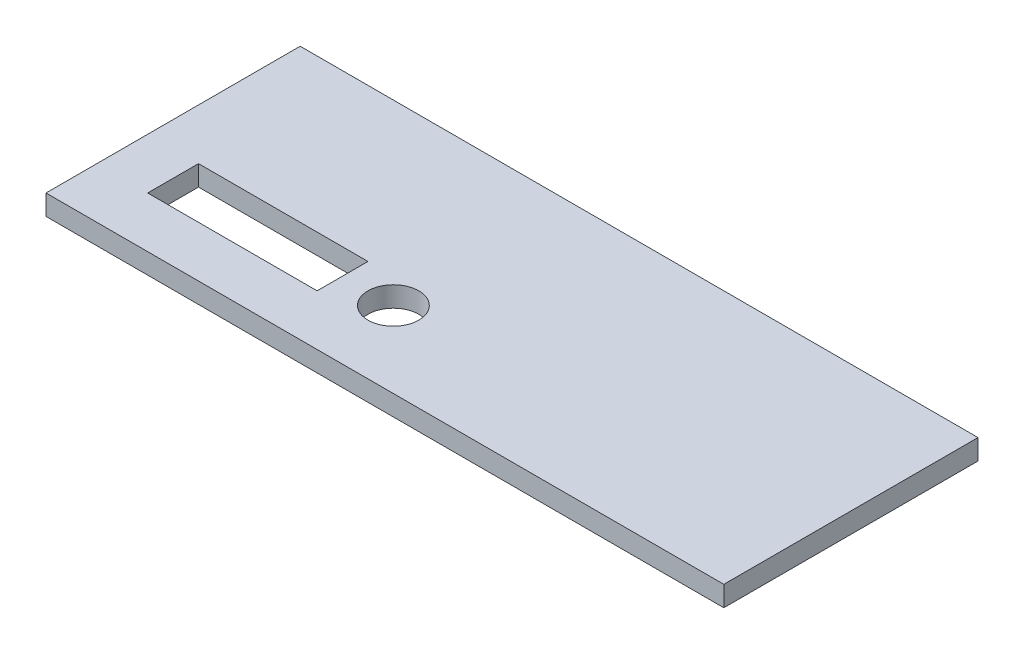
ISO-10303-21;
HEADER;
FILE_DESCRIPTION(('STEP AP214'),'2;1');
FILE_NAME('part.step','',(''),(''),'','','');
FILE_SCHEMA(('AUTOMOTIVE_DESIGN { 1 0 10303 214 1 1 1 1 }'));
ENDSEC;
DATA;
#1=APPLICATION_CONTEXT('core data for automotive mechanical design processes');
#2=APPLICATION_PROTOCOL_DEFINITION('international standard','automotive_design',2000,#1);
#3=PRODUCT_CONTEXT('',#1,'mechanical');
#4=PRODUCT('Part','Part','',(#3));
#5=PRODUCT_RELATED_PRODUCT_CATEGORY('part','',(#4));
#6=PRODUCT_DEFINITION_FORMATION('','',#4);
#7=PRODUCT_DEFINITION_CONTEXT('part definition',#1,'design');
#8=PRODUCT_DEFINITION('design','',#6,#7);
#9=PRODUCT_DEFINITION_SHAPE('','',#8);
#10=(LENGTH_UNIT() NAMED_UNIT(*) SI_UNIT(.MILLI.,.METRE.));
#11=(NAMED_UNIT(*) PLANE_ANGLE_UNIT() SI_UNIT($,.RADIAN.));
#12=(NAMED_UNIT(*) SI_UNIT($,.STERADIAN.) SOLID_ANGLE_UNIT());
#13=UNCERTAINTY_MEASURE_WITH_UNIT(LENGTH_MEASURE(1.E-05),#10,'distance_accuracy_value','');
#14=(GEOMETRIC_REPRESENTATION_CONTEXT(3) GLOBAL_UNCERTAINTY_ASSIGNED_CONTEXT((#13)) GLOBAL_UNIT_ASSIGNED_CONTEXT((#10,
#11,#12)) REPRESENTATION_CONTEXT('',''));
#15=CARTESIAN_POINT('',(0.,0.,0.));
#16=DIRECTION('',(0.,0.,1.));
#17=DIRECTION('',(1.,0.,0.));
#18=AXIS2_PLACEMENT_3D('',#15,#16,#17);
#19=CARTESIAN_POINT('',(0.,6.,0.));
#20=DIRECTION('',(1.,0.,0.));
#21=DIRECTION('',(0.,0.,-1.));
#22=AXIS2_PLACEMENT_3D('',#19,#20,#21);
#23=PLANE('',#22);
#24=DIRECTION('',(0.,0.,1.));
#25=VECTOR('',#24,1.);
#26=CARTESIAN_POINT('',(0.,0.,0.));
#27=LINE('',#26,#25);
#28=CARTESIAN_POINT('',(0.,0.,-75.));
#29=VERTEX_POINT('',#28);
#30=CARTESIAN_POINT('',(0.,0.,0.));
#31=VERTEX_POINT('',#30);
#32=EDGE_CURVE('E133',#29,#31,#27,.T.);
#33=ORIENTED_EDGE('',*,*,#32,.T.);
#34=DIRECTION('',(0.,-1.,0.));
#35=VECTOR('',#34,1.);
#36=CARTESIAN_POINT('',(0.,6.,0.));
#37=LINE('',#36,#35);
#38=CARTESIAN_POINT('',(0.,6.,0.));
#39=VERTEX_POINT('',#38);
#40=EDGE_CURVE('E11',#39,#31,#37,.T.);
#41=ORIENTED_EDGE('',*,*,#40,.F.);
#42=DIRECTION('',(0.,0.,1.));
#43=VECTOR('',#42,1.);
#44=CARTESIAN_POINT('',(0.,6.,0.));
#45=LINE('',#44,#43);
#46=CARTESIAN_POINT('',(0.,6.,-75.));
#47=VERTEX_POINT('',#46);
#48=EDGE_CURVE('E137',#47,#39,#45,.T.);
#49=ORIENTED_EDGE('',*,*,#48,.F.);
#50=DIRECTION('',(0.,-1.,0.));
#51=VECTOR('',#50,1.);
#52=CARTESIAN_POINT('',(0.,6.,-75.));
#53=LINE('',#52,#51);
#54=EDGE_CURVE('E147',#47,#29,#53,.T.);
#55=ORIENTED_EDGE('',*,*,#54,.T.);
#56=EDGE_LOOP('',(#33,#41,#49,#55));
#57=FACE_BOUND('',#56,.T.);
#58=ADVANCED_FACE('F32',(#57),#23,.F.);
#59=CARTESIAN_POINT('',(0.,6.,0.));
#60=DIRECTION('',(0.,0.,-1.));
#61=DIRECTION('',(-1.,0.,0.));
#62=AXIS2_PLACEMENT_3D('',#59,#60,#61);
#63=PLANE('',#62);
#64=DIRECTION('',(1.,0.,0.));
#65=VECTOR('',#64,1.);
#66=CARTESIAN_POINT('',(0.,0.,0.));
#67=LINE('',#66,#65);
#68=CARTESIAN_POINT('',(200.,0.,0.));
#69=VERTEX_POINT('',#68);
#70=EDGE_CURVE('E150',#31,#69,#67,.T.);
#71=ORIENTED_EDGE('',*,*,#70,.T.);
#72=DIRECTION('',(0.,-1.,0.));
#73=VECTOR('',#72,1.);
#74=CARTESIAN_POINT('',(200.,6.,0.));
#75=LINE('',#74,#73);
#76=CARTESIAN_POINT('',(200.,6.,0.));
#77=VERTEX_POINT('',#76);
#78=EDGE_CURVE('E39',#77,#69,#75,.T.);
#79=ORIENTED_EDGE('',*,*,#78,.F.);
#80=DIRECTION('',(1.,0.,0.));
#81=VECTOR('',#80,1.);
#82=CARTESIAN_POINT('',(0.,6.,0.));
#83=LINE('',#82,#81);
#84=EDGE_CURVE('E140',#39,#77,#83,.T.);
#85=ORIENTED_EDGE('',*,*,#84,.F.);
#86=ORIENTED_EDGE('',*,*,#40,.T.);
#87=EDGE_LOOP('',(#71,#79,#85,#86));
#88=FACE_BOUND('',#87,.T.);
#89=ADVANCED_FACE('F178',(#88),#63,.F.);
#90=CARTESIAN_POINT('',(200.,6.,0.));
#91=DIRECTION('',(-1.,0.,0.));
#92=DIRECTION('',(0.,0.,1.));
#93=AXIS2_PLACEMENT_3D('',#90,#91,#92);
#94=PLANE('',#93);
#95=DIRECTION('',(0.,0.,-1.));
#96=VECTOR('',#95,1.);
#97=CARTESIAN_POINT('',(200.,0.,0.));
#98=LINE('',#97,#96);
#99=CARTESIAN_POINT('',(200.,0.,-75.));
#100=VERTEX_POINT('',#99);
#101=EDGE_CURVE('E152',#69,#100,#98,.T.);
#102=ORIENTED_EDGE('',*,*,#101,.T.);
#103=DIRECTION('',(0.,-1.,0.));
#104=VECTOR('',#103,1.);
#105=CARTESIAN_POINT('',(200.,6.,-75.));
#106=LINE('',#105,#104);
#107=CARTESIAN_POINT('',(200.,6.,-75.));
#108=VERTEX_POINT('',#107);
#109=EDGE_CURVE('E157',#108,#100,#106,.T.);
#110=ORIENTED_EDGE('',*,*,#109,.F.);
#111=DIRECTION('',(0.,0.,-1.));
#112=VECTOR('',#111,1.);
#113=CARTESIAN_POINT('',(200.,6.,0.));
#114=LINE('',#113,#112);
#115=EDGE_CURVE('E143',#77,#108,#114,.T.);
#116=ORIENTED_EDGE('',*,*,#115,.F.);
#117=ORIENTED_EDGE('',*,*,#78,.T.);
#118=EDGE_LOOP('',(#102,#110,#116,#117));
#119=FACE_BOUND('',#118,.T.);
#120=ADVANCED_FACE('F164',(#119),#94,.F.);
#121=CARTESIAN_POINT('',(0.,6.,-75.));
#122=DIRECTION('',(0.,0.,1.));
#123=DIRECTION('',(1.,0.,0.));
#124=AXIS2_PLACEMENT_3D('',#121,#122,#123);
#125=PLANE('',#124);
#126=DIRECTION('',(-1.,0.,0.));
#127=VECTOR('',#126,1.);
#128=CARTESIAN_POINT('',(0.,0.,-75.));
#129=LINE('',#128,#127);
#130=EDGE_CURVE('E141',#100,#29,#129,.T.);
#131=ORIENTED_EDGE('',*,*,#130,.T.);
#132=ORIENTED_EDGE('',*,*,#54,.F.);
#133=DIRECTION('',(-1.,0.,0.));
#134=VECTOR('',#133,1.);
#135=CARTESIAN_POINT('',(0.,6.,-75.));
#136=LINE('',#135,#134);
#137=EDGE_CURVE('E145',#108,#47,#136,.T.);
#138=ORIENTED_EDGE('',*,*,#137,.F.);
#139=ORIENTED_EDGE('',*,*,#109,.T.);
#140=EDGE_LOOP('',(#131,#132,#138,#139));
#141=FACE_BOUND('',#140,.T.);
#142=ADVANCED_FACE('F171',(#141),#125,.F.);
#143=CARTESIAN_POINT('',(0.,6.,0.));
#144=DIRECTION('',(0.,-1.,0.));
#145=DIRECTION('',(0.,0.,-1.));
#146=AXIS2_PLACEMENT_3D('',#143,#144,#145);
#147=PLANE('',#146);
#148=CARTESIAN_POINT('',(80.,6.,-22.5));
#149=DIRECTION('',(0.,1.,0.));
#150=DIRECTION('',(0.,0.,1.));
#151=AXIS2_PLACEMENT_3D('',#148,#149,#150);
#152=CIRCLE('',#151,7.50000000000001);
#153=CARTESIAN_POINT('',(80.,6.,-15.));
#154=VERTEX_POINT('',#153);
#155=EDGE_CURVE('E120',#154,#154,#152,.T.);
#156=ORIENTED_EDGE('',*,*,#155,.F.);
#157=EDGE_LOOP('',(#156));
#158=FACE_BOUND('',#157,.T.);
#159=DIRECTION('',(1.,0.,0.));
#160=VECTOR('',#159,1.);
#161=CARTESIAN_POINT('',(15.,6.,-15.));
#162=LINE('',#161,#160);
#163=CARTESIAN_POINT('',(15.,6.,-15.));
#164=VERTEX_POINT('',#163);
#165=CARTESIAN_POINT('',(65.,6.,-15.));
#166=VERTEX_POINT('',#165);
#167=EDGE_CURVE('E126',#164,#166,#162,.T.);
#168=ORIENTED_EDGE('',*,*,#167,.F.);
#169=DIRECTION('',(0.,0.,1.));
#170=VECTOR('',#169,1.);
#171=CARTESIAN_POINT('',(15.,6.,-15.));
#172=LINE('',#171,#170);
#173=CARTESIAN_POINT('',(15.,6.,-30.));
#174=VERTEX_POINT('',#173);
#175=EDGE_CURVE('E46',#174,#164,#172,.T.);
#176=ORIENTED_EDGE('',*,*,#175,.F.);
#177=DIRECTION('',(-1.,0.,0.));
#178=VECTOR('',#177,1.);
#179=CARTESIAN_POINT('',(15.,6.,-30.));
#180=LINE('',#179,#178);
#181=CARTESIAN_POINT('',(65.,6.,-30.));
#182=VERTEX_POINT('',#181);
#183=EDGE_CURVE('E114',#182,#174,#180,.T.);
#184=ORIENTED_EDGE('',*,*,#183,.F.);
#185=DIRECTION('',(0.,0.,-1.));
#186=VECTOR('',#185,1.);
#187=CARTESIAN_POINT('',(65.,6.,-15.));
#188=LINE('',#187,#186);
#189=EDGE_CURVE('E117',#166,#182,#188,.T.);
#190=ORIENTED_EDGE('',*,*,#189,.F.);
#191=EDGE_LOOP('',(#168,#176,#184,#190));
#192=FACE_BOUND('',#191,.T.);
#193=ORIENTED_EDGE('',*,*,#48,.T.);
#194=ORIENTED_EDGE('',*,*,#84,.T.);
#195=ORIENTED_EDGE('',*,*,#115,.T.);
#196=ORIENTED_EDGE('',*,*,#137,.T.);
#197=EDGE_LOOP('',(#193,#194,#195,#196));
#198=FACE_BOUND('',#197,.T.);
#199=ADVANCED_FACE('F177',(#158,#192,#198),#147,.F.);
#200=CARTESIAN_POINT('',(0.,0.,0.));
#201=DIRECTION('',(0.,-1.,0.));
#202=DIRECTION('',(0.,0.,-1.));
#203=AXIS2_PLACEMENT_3D('',#200,#201,#202);
#204=PLANE('',#203);
#205=CARTESIAN_POINT('',(80.,0.,-22.5));
#206=DIRECTION('',(0.,1.,0.));
#207=DIRECTION('',(0.,0.,1.));
#208=AXIS2_PLACEMENT_3D('',#205,#206,#207);
#209=CIRCLE('',#208,7.50000000000001);
#210=CARTESIAN_POINT('',(80.,0.,-15.));
#211=VERTEX_POINT('',#210);
#212=EDGE_CURVE('E127',#211,#211,#209,.T.);
#213=ORIENTED_EDGE('',*,*,#212,.T.);
#214=EDGE_LOOP('',(#213));
#215=FACE_BOUND('',#214,.T.);
#216=DIRECTION('',(0.,0.,1.));
#217=VECTOR('',#216,1.);
#218=CARTESIAN_POINT('',(15.,0.,-15.));
#219=LINE('',#218,#217);
#220=CARTESIAN_POINT('',(15.,0.,-30.));
#221=VERTEX_POINT('',#220);
#222=CARTESIAN_POINT('',(15.,0.,-15.));
#223=VERTEX_POINT('',#222);
#224=EDGE_CURVE('E98',#221,#223,#219,.T.);
#225=ORIENTED_EDGE('',*,*,#224,.T.);
#226=DIRECTION('',(1.,0.,0.));
#227=VECTOR('',#226,1.);
#228=CARTESIAN_POINT('',(15.,0.,-15.));
#229=LINE('',#228,#227);
#230=CARTESIAN_POINT('',(65.,0.,-15.));
#231=VERTEX_POINT('',#230);
#232=EDGE_CURVE('E107',#223,#231,#229,.T.);
#233=ORIENTED_EDGE('',*,*,#232,.T.);
#234=DIRECTION('',(0.,0.,-1.));
#235=VECTOR('',#234,1.);
#236=CARTESIAN_POINT('',(65.,0.,-15.));
#237=LINE('',#236,#235);
#238=CARTESIAN_POINT('',(65.,0.,-30.));
#239=VERTEX_POINT('',#238);
#240=EDGE_CURVE('E54',#231,#239,#237,.T.);
#241=ORIENTED_EDGE('',*,*,#240,.T.);
#242=DIRECTION('',(-1.,0.,0.));
#243=VECTOR('',#242,1.);
#244=CARTESIAN_POINT('',(15.,0.,-30.));
#245=LINE('',#244,#243);
#246=EDGE_CURVE('E104',#239,#221,#245,.T.);
#247=ORIENTED_EDGE('',*,*,#246,.T.);
#248=EDGE_LOOP('',(#225,#233,#241,#247));
#249=FACE_BOUND('',#248,.T.);
#250=ORIENTED_EDGE('',*,*,#32,.F.);
#251=ORIENTED_EDGE('',*,*,#130,.F.);
#252=ORIENTED_EDGE('',*,*,#101,.F.);
#253=ORIENTED_EDGE('',*,*,#70,.F.);
#254=EDGE_LOOP('',(#250,#251,#252,#253));
#255=FACE_BOUND('',#254,.T.);
#256=ADVANCED_FACE('F111',(#215,#249,#255),#204,.T.);
#257=CARTESIAN_POINT('',(15.,0.,-15.));
#258=DIRECTION('',(-1.,0.,0.));
#259=DIRECTION('',(0.,0.,1.));
#260=AXIS2_PLACEMENT_3D('',#257,#258,#259);
#261=PLANE('',#260);
#262=ORIENTED_EDGE('',*,*,#175,.T.);
#263=DIRECTION('',(0.,1.,0.));
#264=VECTOR('',#263,1.);
#265=CARTESIAN_POINT('',(15.,0.,-15.));
#266=LINE('',#265,#264);
#267=EDGE_CURVE('E94',#223,#164,#266,.T.);
#268=ORIENTED_EDGE('',*,*,#267,.F.);
#269=ORIENTED_EDGE('',*,*,#224,.F.);
#270=DIRECTION('',(0.,1.,0.));
#271=VECTOR('',#270,1.);
#272=CARTESIAN_POINT('',(15.,0.,-30.));
#273=LINE('',#272,#271);
#274=EDGE_CURVE('E131',#221,#174,#273,.T.);
#275=ORIENTED_EDGE('',*,*,#274,.T.);
#276=EDGE_LOOP('',(#262,#268,#269,#275));
#277=FACE_BOUND('',#276,.T.);
#278=ADVANCED_FACE('F96',(#277),#261,.F.);
#279=CARTESIAN_POINT('',(15.,0.,-30.));
#280=DIRECTION('',(0.,0.,-1.));
#281=DIRECTION('',(-1.,0.,0.));
#282=AXIS2_PLACEMENT_3D('',#279,#280,#281);
#283=PLANE('',#282);
#284=ORIENTED_EDGE('',*,*,#183,.T.);
#285=ORIENTED_EDGE('',*,*,#274,.F.);
#286=ORIENTED_EDGE('',*,*,#246,.F.);
#287=DIRECTION('',(0.,1.,0.));
#288=VECTOR('',#287,1.);
#289=CARTESIAN_POINT('',(65.,0.,-30.));
#290=LINE('',#289,#288);
#291=EDGE_CURVE('E134',#239,#182,#290,.T.);
#292=ORIENTED_EDGE('',*,*,#291,.T.);
#293=EDGE_LOOP('',(#284,#285,#286,#292));
#294=FACE_BOUND('',#293,.T.);
#295=ADVANCED_FACE('F196',(#294),#283,.F.);
#296=CARTESIAN_POINT('',(65.,0.,-15.));
#297=DIRECTION('',(1.,0.,0.));
#298=DIRECTION('',(0.,0.,-1.));
#299=AXIS2_PLACEMENT_3D('',#296,#297,#298);
#300=PLANE('',#299);
#301=ORIENTED_EDGE('',*,*,#189,.T.);
#302=ORIENTED_EDGE('',*,*,#291,.F.);
#303=ORIENTED_EDGE('',*,*,#240,.F.);
#304=DIRECTION('',(0.,1.,0.));
#305=VECTOR('',#304,1.);
#306=CARTESIAN_POINT('',(65.,0.,-15.));
#307=LINE('',#306,#305);
#308=EDGE_CURVE('E103',#231,#166,#307,.T.);
#309=ORIENTED_EDGE('',*,*,#308,.T.);
#310=EDGE_LOOP('',(#301,#302,#303,#309));
#311=FACE_BOUND('',#310,.T.);
#312=ADVANCED_FACE('F200',(#311),#300,.F.);
#313=CARTESIAN_POINT('',(15.,0.,-15.));
#314=DIRECTION('',(0.,0.,1.));
#315=DIRECTION('',(1.,0.,0.));
#316=AXIS2_PLACEMENT_3D('',#313,#314,#315);
#317=PLANE('',#316);
#318=ORIENTED_EDGE('',*,*,#167,.T.);
#319=ORIENTED_EDGE('',*,*,#308,.F.);
#320=ORIENTED_EDGE('',*,*,#232,.F.);
#321=ORIENTED_EDGE('',*,*,#267,.T.);
#322=EDGE_LOOP('',(#318,#319,#320,#321));
#323=FACE_BOUND('',#322,.T.);
#324=ADVANCED_FACE('F108',(#323),#317,.F.);
#325=CARTESIAN_POINT('',(80.,0.,-22.5));
#326=DIRECTION('',(0.,1.,0.));
#327=DIRECTION('',(0.,0.,1.));
#328=AXIS2_PLACEMENT_3D('',#325,#326,#327);
#329=CYLINDRICAL_SURFACE('',#328,7.50000000000001);
#330=ORIENTED_EDGE('',*,*,#212,.F.);
#331=EDGE_LOOP('',(#330));
#332=FACE_BOUND('',#331,.T.);
#333=ORIENTED_EDGE('',*,*,#155,.T.);
#334=EDGE_LOOP('',(#333));
#335=FACE_BOUND('',#334,.T.);
#336=ADVANCED_FACE('F199',(#332,#335),#329,.F.);
#337=CLOSED_SHELL('',(#58,#89,#120,#142,#199,#256,#278,#295,#312,#324,#336));
#338=MANIFOLD_SOLID_BREP('B2',#337);
#339=ADVANCED_BREP_SHAPE_REPRESENTATION('',(#18,#338),#14);
#340=SHAPE_DEFINITION_REPRESENTATION(#9,#339);
ENDSEC;
END-ISO-10303-21;
